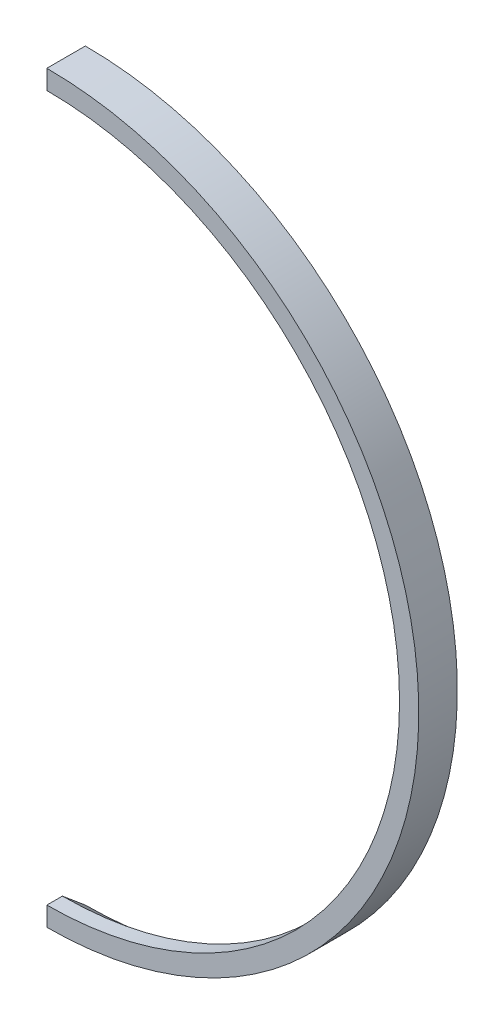
ISO-10303-21;
HEADER;
FILE_DESCRIPTION(('STEP AP214'),'2;1');
FILE_NAME('part.step','',(''),(''),'','','');
FILE_SCHEMA(('AUTOMOTIVE_DESIGN { 1 0 10303 214 1 1 1 1 }'));
ENDSEC;
DATA;
#1=APPLICATION_CONTEXT('core data for automotive mechanical design processes');
#2=APPLICATION_PROTOCOL_DEFINITION('international standard','automotive_design',2000,#1);
#3=PRODUCT_CONTEXT('',#1,'mechanical');
#4=PRODUCT('Part','Part','',(#3));
#5=PRODUCT_RELATED_PRODUCT_CATEGORY('part','',(#4));
#6=PRODUCT_DEFINITION_FORMATION('','',#4);
#7=PRODUCT_DEFINITION_CONTEXT('part definition',#1,'design');
#8=PRODUCT_DEFINITION('design','',#6,#7);
#9=PRODUCT_DEFINITION_SHAPE('','',#8);
#10=(LENGTH_UNIT() NAMED_UNIT(*) SI_UNIT(.MILLI.,.METRE.));
#11=(NAMED_UNIT(*) PLANE_ANGLE_UNIT() SI_UNIT($,.RADIAN.));
#12=(NAMED_UNIT(*) SI_UNIT($,.STERADIAN.) SOLID_ANGLE_UNIT());
#13=UNCERTAINTY_MEASURE_WITH_UNIT(LENGTH_MEASURE(1.E-05),#10,'distance_accuracy_value','');
#14=(GEOMETRIC_REPRESENTATION_CONTEXT(3) GLOBAL_UNCERTAINTY_ASSIGNED_CONTEXT((#13)) GLOBAL_UNIT_ASSIGNED_CONTEXT((#10,
#11,#12)) REPRESENTATION_CONTEXT('',''));
#15=CARTESIAN_POINT('',(0.,0.,0.));
#16=DIRECTION('',(0.,0.,1.));
#17=DIRECTION('',(1.,0.,0.));
#18=AXIS2_PLACEMENT_3D('',#15,#16,#17);
#19=CARTESIAN_POINT('',(0.,0.,0.));
#20=DIRECTION('',(1.,0.,0.));
#21=DIRECTION('',(0.,0.,-1.));
#22=AXIS2_PLACEMENT_3D('',#19,#20,#21);
#23=PLANE('',#22);
#24=DIRECTION('',(0.,0.,1.));
#25=VECTOR('',#24,1.);
#26=CARTESIAN_POINT('',(0.,17.8679209897138,978.530003661169));
#27=LINE('',#26,#25);
#28=CARTESIAN_POINT('',(0.,17.8679209897138,-40.94905180583));
#29=VERTEX_POINT('',#28);
#30=CARTESIAN_POINT('',(0.,17.8679209897138,-38.94905180583));
#31=VERTEX_POINT('',#30);
#32=EDGE_CURVE('E81',#29,#31,#27,.T.);
#33=ORIENTED_EDGE('',*,*,#32,.F.);
#34=DIRECTION('',(0.,-0.64278760968652,0.766044443118995));
#35=VECTOR('',#34,1.);
#36=CARTESIAN_POINT('',(0.,-1.43207901028621,-17.9482074687605));
#37=LINE('',#36,#35);
#38=CARTESIAN_POINT('',(0.,16.8679209897138,-39.7572982132357));
#39=VERTEX_POINT('',#38);
#40=EDGE_CURVE('E90',#39,#29,#37,.F.);
#41=ORIENTED_EDGE('',*,*,#40,.F.);
#42=DIRECTION('',(0.,0.,1.));
#43=VECTOR('',#42,1.);
#44=CARTESIAN_POINT('',(0.,16.8679209897138,978.530003661169));
#45=LINE('',#44,#43);
#46=CARTESIAN_POINT('',(0.,16.8679209897138,-38.94905180583));
#47=VERTEX_POINT('',#46);
#48=EDGE_CURVE('E42',#47,#39,#45,.F.);
#49=ORIENTED_EDGE('',*,*,#48,.F.);
#50=DIRECTION('',(0.,-1.,0.));
#51=VECTOR('',#50,1.);
#52=CARTESIAN_POINT('',(0.,17.8679209897138,-38.9490518058299));
#53=LINE('',#52,#51);
#54=EDGE_CURVE('E11',#31,#47,#53,.T.);
#55=ORIENTED_EDGE('',*,*,#54,.F.);
#56=EDGE_LOOP('',(#33,#41,#49,#55));
#57=FACE_BOUND('',#56,.T.);
#58=ADVANCED_FACE('F39',(#57),#23,.F.);
#59=DIRECTION('',(0.,0.,1.));
#60=VECTOR('',#59,1.);
#61=CARTESIAN_POINT('',(0.,-19.7320790102862,978.530003661169));
#62=LINE('',#61,#60);
#63=CARTESIAN_POINT('',(0.,-19.7320790102862,-39.7572982132357));
#64=VERTEX_POINT('',#63);
#65=CARTESIAN_POINT('',(0.,-19.7320790102862,-38.94905180583));
#66=VERTEX_POINT('',#65);
#67=EDGE_CURVE('E105',#64,#66,#62,.T.);
#68=ORIENTED_EDGE('',*,*,#67,.F.);
#69=DIRECTION('',(0.,-0.64278760968652,-0.766044443118995));
#70=VECTOR('',#69,1.);
#71=CARTESIAN_POINT('',(0.,-1.43207901028621,-17.9482074687605));
#72=LINE('',#71,#70);
#73=CARTESIAN_POINT('',(0.,-20.7320790102862,-40.94905180583));
#74=VERTEX_POINT('',#73);
#75=EDGE_CURVE('E103',#74,#64,#72,.F.);
#76=ORIENTED_EDGE('',*,*,#75,.F.);
#77=DIRECTION('',(0.,0.,1.));
#78=VECTOR('',#77,1.);
#79=CARTESIAN_POINT('',(0.,-20.7320790102862,978.530003661169));
#80=LINE('',#79,#78);
#81=CARTESIAN_POINT('',(0.,-20.7320790102862,-38.94905180583));
#82=VERTEX_POINT('',#81);
#83=EDGE_CURVE('E91',#82,#74,#80,.F.);
#84=ORIENTED_EDGE('',*,*,#83,.F.);
#85=EDGE_CURVE('E47',#66,#82,#53,.T.);
#86=ORIENTED_EDGE('',*,*,#85,.F.);
#87=EDGE_LOOP('',(#68,#76,#84,#86));
#88=FACE_BOUND('',#87,.T.);
#89=ADVANCED_FACE('F112',(#88),#23,.F.);
#90=CARTESIAN_POINT('',(0.,-1.43207901028621,978.530003661169));
#91=DIRECTION('',(0.,0.,1.));
#92=DIRECTION('',(1.,0.,0.));
#93=AXIS2_PLACEMENT_3D('',#90,#91,#92);
#94=CYLINDRICAL_SURFACE('',#93,18.3);
#95=CARTESIAN_POINT('',(0.,-1.43207901028621,-38.94905180583));
#96=DIRECTION('',(0.,0.,1.));
#97=DIRECTION('',(1.,0.,0.));
#98=AXIS2_PLACEMENT_3D('',#95,#96,#97);
#99=CIRCLE('',#98,18.3);
#100=EDGE_CURVE('E100',#66,#47,#99,.T.);
#101=ORIENTED_EDGE('',*,*,#100,.T.);
#102=ORIENTED_EDGE('',*,*,#48,.T.);
#103=CARTESIAN_POINT('',(0.,-1.43207901028621,-39.7572982132357));
#104=DIRECTION('',(0.,0.,1.));
#105=DIRECTION('',(1.,0.,0.));
#106=AXIS2_PLACEMENT_3D('',#103,#104,#105);
#107=CIRCLE('',#106,18.3);
#108=EDGE_CURVE('E95',#64,#39,#107,.T.);
#109=ORIENTED_EDGE('',*,*,#108,.F.);
#110=ORIENTED_EDGE('',*,*,#67,.T.);
#111=EDGE_LOOP('',(#101,#102,#109,#110));
#112=FACE_BOUND('',#111,.T.);
#113=ADVANCED_FACE('F111',(#112),#94,.F.);
#114=CARTESIAN_POINT('',(0.,17.8679209897138,-38.9490518058299));
#115=DIRECTION('',(0.,0.,-1.));
#116=DIRECTION('',(-1.,0.,0.));
#117=AXIS2_PLACEMENT_3D('',#114,#115,#116);
#118=PLANE('',#117);
#119=CARTESIAN_POINT('',(0.,-1.43207901028621,-38.94905180583));
#120=DIRECTION('',(0.,0.,1.));
#121=DIRECTION('',(1.,0.,0.));
#122=AXIS2_PLACEMENT_3D('',#119,#120,#121);
#123=CIRCLE('',#122,19.3);
#124=EDGE_CURVE('E87',#82,#31,#123,.T.);
#125=ORIENTED_EDGE('',*,*,#124,.T.);
#126=ORIENTED_EDGE('',*,*,#54,.T.);
#127=ORIENTED_EDGE('',*,*,#100,.F.);
#128=ORIENTED_EDGE('',*,*,#85,.T.);
#129=EDGE_LOOP('',(#125,#126,#127,#128));
#130=FACE_BOUND('',#129,.T.);
#131=ADVANCED_FACE('F93',(#130),#118,.F.);
#132=CARTESIAN_POINT('',(0.,-1.43207901028621,-39.7572982132357));
#133=DIRECTION('',(0.,0.,-1.));
#134=DIRECTION('',(-1.,0.,0.));
#135=AXIS2_PLACEMENT_3D('',#132,#133,#134);
#136=CONICAL_SURFACE('',#135,18.3,0.698131700797706);
#137=CARTESIAN_POINT('',(0.,-1.43207901028621,-40.94905180583));
#138=DIRECTION('',(0.,0.,1.));
#139=DIRECTION('',(1.,0.,0.));
#140=AXIS2_PLACEMENT_3D('',#137,#138,#139);
#141=CIRCLE('',#140,19.3);
#142=EDGE_CURVE('E89',#74,#29,#141,.T.);
#143=ORIENTED_EDGE('',*,*,#142,.F.);
#144=ORIENTED_EDGE('',*,*,#75,.T.);
#145=ORIENTED_EDGE('',*,*,#108,.T.);
#146=ORIENTED_EDGE('',*,*,#40,.T.);
#147=EDGE_LOOP('',(#143,#144,#145,#146));
#148=FACE_BOUND('',#147,.T.);
#149=ADVANCED_FACE('F107',(#148),#136,.F.);
#150=CARTESIAN_POINT('',(0.,-1.43207901028621,978.530003661169));
#151=DIRECTION('',(0.,0.,1.));
#152=DIRECTION('',(1.,0.,0.));
#153=AXIS2_PLACEMENT_3D('',#150,#151,#152);
#154=CYLINDRICAL_SURFACE('',#153,19.3);
#155=ORIENTED_EDGE('',*,*,#142,.T.);
#156=ORIENTED_EDGE('',*,*,#32,.T.);
#157=ORIENTED_EDGE('',*,*,#124,.F.);
#158=ORIENTED_EDGE('',*,*,#83,.T.);
#159=EDGE_LOOP('',(#155,#156,#157,#158));
#160=FACE_BOUND('',#159,.T.);
#161=ADVANCED_FACE('F86',(#160),#154,.T.);
#162=CLOSED_SHELL('',(#58,#89,#113,#131,#149,#161));
#163=MANIFOLD_SOLID_BREP('B2',#162);
#164=ADVANCED_BREP_SHAPE_REPRESENTATION('',(#18,#163),#14);
#165=SHAPE_DEFINITION_REPRESENTATION(#9,#164);
ENDSEC;
END-ISO-10303-21;
